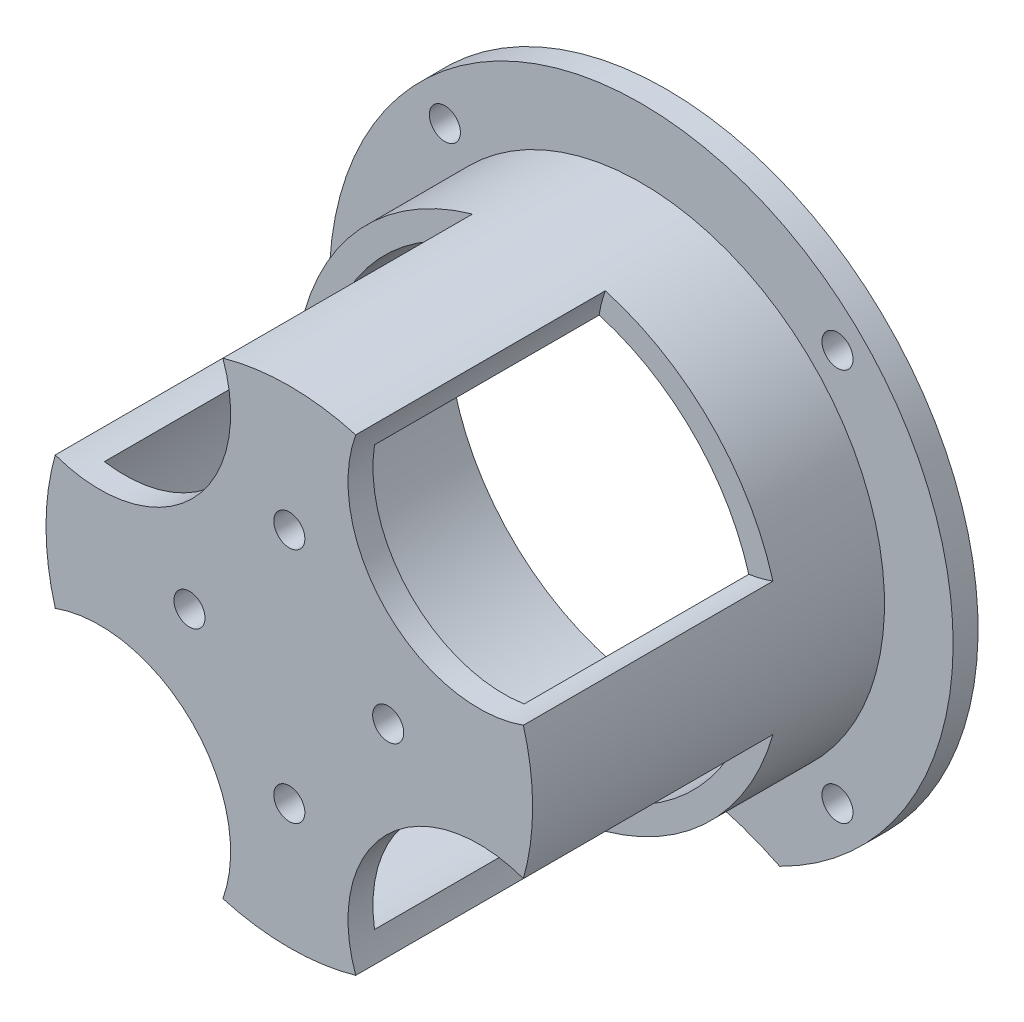
ISO-10303-21;
HEADER;
FILE_DESCRIPTION(('STEP AP214'),'2;1');
FILE_NAME('part.step','',(''),(''),'','','');
FILE_SCHEMA(('AUTOMOTIVE_DESIGN { 1 0 10303 214 1 1 1 1 }'));
ENDSEC;
DATA;
#1=APPLICATION_CONTEXT('core data for automotive mechanical design processes');
#2=APPLICATION_PROTOCOL_DEFINITION('international standard','automotive_design',2000,#1);
#3=PRODUCT_CONTEXT('',#1,'mechanical');
#4=PRODUCT('Part','Part','',(#3));
#5=PRODUCT_RELATED_PRODUCT_CATEGORY('part','',(#4));
#6=PRODUCT_DEFINITION_FORMATION('','',#4);
#7=PRODUCT_DEFINITION_CONTEXT('part definition',#1,'design');
#8=PRODUCT_DEFINITION('design','',#6,#7);
#9=PRODUCT_DEFINITION_SHAPE('','',#8);
#10=(LENGTH_UNIT() NAMED_UNIT(*) SI_UNIT(.MILLI.,.METRE.));
#11=(NAMED_UNIT(*) PLANE_ANGLE_UNIT() SI_UNIT($,.RADIAN.));
#12=(NAMED_UNIT(*) SI_UNIT($,.STERADIAN.) SOLID_ANGLE_UNIT());
#13=UNCERTAINTY_MEASURE_WITH_UNIT(LENGTH_MEASURE(1.E-05),#10,'distance_accuracy_value','');
#14=(GEOMETRIC_REPRESENTATION_CONTEXT(3) GLOBAL_UNCERTAINTY_ASSIGNED_CONTEXT((#13)) GLOBAL_UNIT_ASSIGNED_CONTEXT((#10,
#11,#12)) REPRESENTATION_CONTEXT('',''));
#15=CARTESIAN_POINT('',(0.,0.,0.));
#16=DIRECTION('',(0.,0.,1.));
#17=DIRECTION('',(1.,0.,0.));
#18=AXIS2_PLACEMENT_3D('',#15,#16,#17);
#19=CARTESIAN_POINT('',(0.,0.,0.));
#20=DIRECTION('',(0.,0.,1.));
#21=DIRECTION('',(1.,0.,0.));
#22=AXIS2_PLACEMENT_3D('',#19,#20,#21);
#23=CYLINDRICAL_SURFACE('',#22,9.75);
#24=DIRECTION('',(0.,0.,1.));
#25=VECTOR('',#24,1.);
#26=CARTESIAN_POINT('',(9.37964320773784,-2.66172750211913,-5.));
#27=LINE('',#26,#25);
#28=CARTESIAN_POINT('',(9.37964320773784,-2.66172750211913,-10.));
#29=VERTEX_POINT('',#28);
#30=CARTESIAN_POINT('',(9.37964320773784,-2.66172750211913,0.));
#31=VERTEX_POINT('',#30);
#32=EDGE_CURVE('E305',#29,#31,#27,.T.);
#33=ORIENTED_EDGE('',*,*,#32,.F.);
#34=CARTESIAN_POINT('',(0.,0.,-10.));
#35=DIRECTION('',(0.,0.,1.));
#36=DIRECTION('',(1.,0.,0.));
#37=AXIS2_PLACEMENT_3D('',#34,#35,#36);
#38=CIRCLE('',#37,9.75);
#39=CARTESIAN_POINT('',(2.66172750211911,-9.37964320773785,-10.));
#40=VERTEX_POINT('',#39);
#41=EDGE_CURVE('E299',#29,#40,#38,.F.);
#42=ORIENTED_EDGE('',*,*,#41,.T.);
#43=DIRECTION('',(0.,0.,1.));
#44=VECTOR('',#43,1.);
#45=CARTESIAN_POINT('',(2.6617275021191,-9.37964320773785,-5.));
#46=LINE('',#45,#44);
#47=CARTESIAN_POINT('',(2.66172750211911,-9.37964320773785,0.));
#48=VERTEX_POINT('',#47);
#49=EDGE_CURVE('E302',#48,#40,#46,.F.);
#50=ORIENTED_EDGE('',*,*,#49,.F.);
#51=CARTESIAN_POINT('',(0.,0.,0.));
#52=DIRECTION('',(0.,0.,1.));
#53=DIRECTION('',(1.,0.,0.));
#54=AXIS2_PLACEMENT_3D('',#51,#52,#53);
#55=CIRCLE('',#54,9.75);
#56=CARTESIAN_POINT('',(-2.66172750211913,-9.37964320773784,0.));
#57=VERTEX_POINT('',#56);
#58=EDGE_CURVE('E264',#57,#48,#55,.T.);
#59=ORIENTED_EDGE('',*,*,#58,.F.);
#60=DIRECTION('',(0.,0.,1.));
#61=VECTOR('',#60,1.);
#62=CARTESIAN_POINT('',(-2.66172750211913,-9.37964320773785,-5.));
#63=LINE('',#62,#61);
#64=CARTESIAN_POINT('',(-2.66172750211913,-9.37964320773784,-10.));
#65=VERTEX_POINT('',#64);
#66=EDGE_CURVE('E297',#65,#57,#63,.T.);
#67=ORIENTED_EDGE('',*,*,#66,.F.);
#68=CARTESIAN_POINT('',(0.,0.,-10.));
#69=DIRECTION('',(0.,0.,1.));
#70=DIRECTION('',(1.,0.,0.));
#71=AXIS2_PLACEMENT_3D('',#68,#69,#70);
#72=CIRCLE('',#71,9.75);
#73=CARTESIAN_POINT('',(-9.37964320773785,-2.6617275021191,-10.));
#74=VERTEX_POINT('',#73);
#75=EDGE_CURVE('E291',#65,#74,#72,.F.);
#76=ORIENTED_EDGE('',*,*,#75,.T.);
#77=DIRECTION('',(0.,0.,1.));
#78=VECTOR('',#77,1.);
#79=CARTESIAN_POINT('',(-9.37964320773786,-2.6617275021191,-5.));
#80=LINE('',#79,#78);
#81=CARTESIAN_POINT('',(-9.37964320773785,-2.6617275021191,0.));
#82=VERTEX_POINT('',#81);
#83=EDGE_CURVE('E294',#82,#74,#80,.F.);
#84=ORIENTED_EDGE('',*,*,#83,.F.);
#85=CARTESIAN_POINT('',(-9.37964320773784,2.66172750211913,0.));
#86=VERTEX_POINT('',#85);
#87=EDGE_CURVE('E431',#86,#82,#55,.T.);
#88=ORIENTED_EDGE('',*,*,#87,.F.);
#89=DIRECTION('',(0.,0.,1.));
#90=VECTOR('',#89,1.);
#91=CARTESIAN_POINT('',(-9.37964320773785,2.66172750211913,-5.));
#92=LINE('',#91,#90);
#93=CARTESIAN_POINT('',(-9.37964320773784,2.66172750211913,-10.));
#94=VERTEX_POINT('',#93);
#95=EDGE_CURVE('E289',#94,#86,#92,.T.);
#96=ORIENTED_EDGE('',*,*,#95,.F.);
#97=CARTESIAN_POINT('',(0.,0.,-10.));
#98=DIRECTION('',(0.,0.,1.));
#99=DIRECTION('',(1.,0.,0.));
#100=AXIS2_PLACEMENT_3D('',#97,#98,#99);
#101=CIRCLE('',#100,9.75);
#102=CARTESIAN_POINT('',(-2.6617275021191,9.37964320773785,-10.));
#103=VERTEX_POINT('',#102);
#104=EDGE_CURVE('E283',#94,#103,#101,.F.);
#105=ORIENTED_EDGE('',*,*,#104,.T.);
#106=DIRECTION('',(0.,0.,1.));
#107=VECTOR('',#106,1.);
#108=CARTESIAN_POINT('',(-2.6617275021191,9.37964320773786,-5.));
#109=LINE('',#108,#107);
#110=CARTESIAN_POINT('',(-2.6617275021191,9.37964320773785,0.));
#111=VERTEX_POINT('',#110);
#112=EDGE_CURVE('E286',#111,#103,#109,.F.);
#113=ORIENTED_EDGE('',*,*,#112,.F.);
#114=CARTESIAN_POINT('',(2.66172750211913,9.37964320773784,0.));
#115=VERTEX_POINT('',#114);
#116=EDGE_CURVE('E266',#115,#111,#55,.T.);
#117=ORIENTED_EDGE('',*,*,#116,.F.);
#118=DIRECTION('',(0.,0.,1.));
#119=VECTOR('',#118,1.);
#120=CARTESIAN_POINT('',(2.66172750211913,9.37964320773784,-5.));
#121=LINE('',#120,#119);
#122=CARTESIAN_POINT('',(2.66172750211913,9.37964320773784,-10.));
#123=VERTEX_POINT('',#122);
#124=EDGE_CURVE('E281',#123,#115,#121,.T.);
#125=ORIENTED_EDGE('',*,*,#124,.F.);
#126=CARTESIAN_POINT('',(0.,0.,-10.));
#127=DIRECTION('',(0.,0.,1.));
#128=DIRECTION('',(1.,0.,0.));
#129=AXIS2_PLACEMENT_3D('',#126,#127,#128);
#130=CIRCLE('',#129,9.75);
#131=CARTESIAN_POINT('',(9.37964320773785,2.6617275021191,-10.));
#132=VERTEX_POINT('',#131);
#133=EDGE_CURVE('E275',#123,#132,#130,.F.);
#134=ORIENTED_EDGE('',*,*,#133,.T.);
#135=DIRECTION('',(0.,0.,1.));
#136=VECTOR('',#135,1.);
#137=CARTESIAN_POINT('',(9.37964320773786,2.6617275021191,-5.));
#138=LINE('',#137,#136);
#139=CARTESIAN_POINT('',(9.37964320773785,2.6617275021191,0.));
#140=VERTEX_POINT('',#139);
#141=EDGE_CURVE('E278',#140,#132,#138,.F.);
#142=ORIENTED_EDGE('',*,*,#141,.F.);
#143=EDGE_CURVE('E261',#31,#140,#55,.T.);
#144=ORIENTED_EDGE('',*,*,#143,.F.);
#145=EDGE_LOOP('',(#33,#42,#50,#59,#67,#76,#84,#88,#96,#105,#113,#117,#125,#134,#142,#144));
#146=FACE_BOUND('',#145,.T.);
#147=CARTESIAN_POINT('',(0.,0.,-14.1));
#148=DIRECTION('',(0.,0.,-1.));
#149=DIRECTION('',(-1.,0.,0.));
#150=AXIS2_PLACEMENT_3D('',#147,#148,#149);
#151=CIRCLE('',#150,9.75);
#152=CARTESIAN_POINT('',(-9.75,0.,-14.1));
#153=VERTEX_POINT('',#152);
#154=EDGE_CURVE('E176',#153,#153,#151,.F.);
#155=ORIENTED_EDGE('',*,*,#154,.T.);
#156=EDGE_LOOP('',(#155));
#157=FACE_BOUND('',#156,.T.);
#158=ADVANCED_FACE('F35',(#146,#157),#23,.T.);
#159=CARTESIAN_POINT('',(0.,0.,0.));
#160=DIRECTION('',(0.,0.,1.));
#161=DIRECTION('',(1.,0.,0.));
#162=AXIS2_PLACEMENT_3D('',#159,#160,#161);
#163=PLANE('',#162);
#164=CARTESIAN_POINT('',(7.60139789775537,-7.6013978977554,0.));
#165=DIRECTION('',(0.,0.,1.));
#166=DIRECTION('',(1.,0.,0.));
#167=AXIS2_PLACEMENT_3D('',#164,#165,#166);
#168=CIRCLE('',#167,5.25);
#169=EDGE_CURVE('E191',#31,#48,#168,.T.);
#170=ORIENTED_EDGE('',*,*,#169,.F.);
#171=ORIENTED_EDGE('',*,*,#143,.T.);
#172=CARTESIAN_POINT('',(7.6013978977554,7.60139789775537,0.));
#173=DIRECTION('',(0.,0.,1.));
#174=DIRECTION('',(1.,0.,0.));
#175=AXIS2_PLACEMENT_3D('',#172,#173,#174);
#176=CIRCLE('',#175,5.25);
#177=EDGE_CURVE('E180',#115,#140,#176,.T.);
#178=ORIENTED_EDGE('',*,*,#177,.F.);
#179=ORIENTED_EDGE('',*,*,#116,.T.);
#180=CARTESIAN_POINT('',(-7.60139789775537,7.6013978977554,0.));
#181=DIRECTION('',(0.,0.,1.));
#182=DIRECTION('',(1.,0.,0.));
#183=AXIS2_PLACEMENT_3D('',#180,#181,#182);
#184=CIRCLE('',#183,5.25);
#185=EDGE_CURVE('E198',#86,#111,#184,.T.);
#186=ORIENTED_EDGE('',*,*,#185,.F.);
#187=ORIENTED_EDGE('',*,*,#87,.T.);
#188=CARTESIAN_POINT('',(-7.6013978977554,-7.60139789775537,0.));
#189=DIRECTION('',(0.,0.,1.));
#190=DIRECTION('',(1.,0.,0.));
#191=AXIS2_PLACEMENT_3D('',#188,#189,#190);
#192=CIRCLE('',#191,5.25);
#193=EDGE_CURVE('E193',#57,#82,#192,.T.);
#194=ORIENTED_EDGE('',*,*,#193,.F.);
#195=ORIENTED_EDGE('',*,*,#58,.T.);
#196=EDGE_LOOP('',(#170,#171,#178,#179,#186,#187,#194,#195));
#197=FACE_BOUND('',#196,.T.);
#198=CARTESIAN_POINT('',(0.,4.75,0.));
#199=DIRECTION('',(0.,0.,1.));
#200=DIRECTION('',(1.,0.,0.));
#201=AXIS2_PLACEMENT_3D('',#198,#199,#200);
#202=CIRCLE('',#201,0.6225);
#203=CARTESIAN_POINT('',(0.6225,4.75,0.));
#204=VERTEX_POINT('',#203);
#205=EDGE_CURVE('E204',#204,#204,#202,.T.);
#206=ORIENTED_EDGE('',*,*,#205,.F.);
#207=EDGE_LOOP('',(#206));
#208=FACE_BOUND('',#207,.T.);
#209=CARTESIAN_POINT('',(3.96157843976001,0.,0.));
#210=DIRECTION('',(0.,0.,1.));
#211=DIRECTION('',(1.,0.,0.));
#212=AXIS2_PLACEMENT_3D('',#209,#210,#211);
#213=CIRCLE('',#212,0.6225);
#214=CARTESIAN_POINT('',(4.58407843976001,0.,0.));
#215=VERTEX_POINT('',#214);
#216=EDGE_CURVE('E207',#215,#215,#213,.T.);
#217=ORIENTED_EDGE('',*,*,#216,.F.);
#218=EDGE_LOOP('',(#217));
#219=FACE_BOUND('',#218,.T.);
#220=CARTESIAN_POINT('',(0.,-4.75,0.));
#221=DIRECTION('',(0.,0.,1.));
#222=DIRECTION('',(1.,0.,0.));
#223=AXIS2_PLACEMENT_3D('',#220,#221,#222);
#224=CIRCLE('',#223,0.6225);
#225=CARTESIAN_POINT('',(0.6225,-4.75,0.));
#226=VERTEX_POINT('',#225);
#227=EDGE_CURVE('E212',#226,#226,#224,.T.);
#228=ORIENTED_EDGE('',*,*,#227,.F.);
#229=EDGE_LOOP('',(#228));
#230=FACE_BOUND('',#229,.T.);
#231=CARTESIAN_POINT('',(-4.,0.,0.));
#232=DIRECTION('',(0.,0.,1.));
#233=DIRECTION('',(1.,0.,0.));
#234=AXIS2_PLACEMENT_3D('',#231,#232,#233);
#235=CIRCLE('',#234,0.6225);
#236=CARTESIAN_POINT('',(-3.3775,0.,0.));
#237=VERTEX_POINT('',#236);
#238=EDGE_CURVE('E215',#237,#237,#235,.T.);
#239=ORIENTED_EDGE('',*,*,#238,.F.);
#240=EDGE_LOOP('',(#239));
#241=FACE_BOUND('',#240,.T.);
#242=ADVANCED_FACE('F385',(#197,#208,#219,#230,#241),#163,.T.);
#243=CARTESIAN_POINT('',(8.75,0.,-1.));
#244=DIRECTION('',(0.,0.,-1.));
#245=DIRECTION('',(-1.,0.,0.));
#246=AXIS2_PLACEMENT_3D('',#243,#244,#245);
#247=PLANE('',#246);
#248=CARTESIAN_POINT('',(7.60139789775537,-7.6013978977554,-1.));
#249=DIRECTION('',(0.,0.,-1.));
#250=DIRECTION('',(-1.,0.,0.));
#251=AXIS2_PLACEMENT_3D('',#248,#249,#250);
#252=CIRCLE('',#251,5.25);
#253=CARTESIAN_POINT('',(2.41410221173649,-8.41038706072967,-1.));
#254=VERTEX_POINT('',#253);
#255=CARTESIAN_POINT('',(8.41038706072966,-2.41410221173651,-1.));
#256=VERTEX_POINT('',#255);
#257=EDGE_CURVE('E255',#254,#256,#252,.T.);
#258=ORIENTED_EDGE('',*,*,#257,.F.);
#259=CARTESIAN_POINT('',(0.,0.,-1.));
#260=DIRECTION('',(0.,0.,1.));
#261=DIRECTION('',(1.,0.,0.));
#262=AXIS2_PLACEMENT_3D('',#259,#260,#261);
#263=CIRCLE('',#262,8.75);
#264=CARTESIAN_POINT('',(-2.41410221173651,-8.41038706072966,-1.));
#265=VERTEX_POINT('',#264);
#266=EDGE_CURVE('E273',#265,#254,#263,.T.);
#267=ORIENTED_EDGE('',*,*,#266,.F.);
#268=CARTESIAN_POINT('',(-7.6013978977554,-7.60139789775537,-1.));
#269=DIRECTION('',(0.,0.,-1.));
#270=DIRECTION('',(-1.,0.,0.));
#271=AXIS2_PLACEMENT_3D('',#268,#269,#270);
#272=CIRCLE('',#271,5.25);
#273=CARTESIAN_POINT('',(-8.41038706072967,-2.41410221173648,-1.));
#274=VERTEX_POINT('',#273);
#275=EDGE_CURVE('E245',#274,#265,#272,.T.);
#276=ORIENTED_EDGE('',*,*,#275,.F.);
#277=CARTESIAN_POINT('',(-8.41038706072966,2.41410221173651,-1.));
#278=VERTEX_POINT('',#277);
#279=EDGE_CURVE('E449',#278,#274,#263,.T.);
#280=ORIENTED_EDGE('',*,*,#279,.F.);
#281=CARTESIAN_POINT('',(-7.60139789775537,7.6013978977554,-1.));
#282=DIRECTION('',(0.,0.,-1.));
#283=DIRECTION('',(-1.,0.,0.));
#284=AXIS2_PLACEMENT_3D('',#281,#282,#283);
#285=CIRCLE('',#284,5.25);
#286=CARTESIAN_POINT('',(-2.41410221173648,8.41038706072967,-1.));
#287=VERTEX_POINT('',#286);
#288=EDGE_CURVE('E235',#287,#278,#285,.T.);
#289=ORIENTED_EDGE('',*,*,#288,.F.);
#290=CARTESIAN_POINT('',(2.41410221173651,8.41038706072966,-1.));
#291=VERTEX_POINT('',#290);
#292=EDGE_CURVE('E274',#291,#287,#263,.T.);
#293=ORIENTED_EDGE('',*,*,#292,.F.);
#294=CARTESIAN_POINT('',(7.6013978977554,7.60139789775537,-1.));
#295=DIRECTION('',(0.,0.,-1.));
#296=DIRECTION('',(-1.,0.,0.));
#297=AXIS2_PLACEMENT_3D('',#294,#295,#296);
#298=CIRCLE('',#297,5.25);
#299=CARTESIAN_POINT('',(8.41038706072967,2.41410221173648,-1.));
#300=VERTEX_POINT('',#299);
#301=EDGE_CURVE('E225',#300,#291,#298,.T.);
#302=ORIENTED_EDGE('',*,*,#301,.F.);
#303=EDGE_CURVE('E270',#256,#300,#263,.T.);
#304=ORIENTED_EDGE('',*,*,#303,.F.);
#305=EDGE_LOOP('',(#258,#267,#276,#280,#289,#293,#302,#304));
#306=FACE_BOUND('',#305,.T.);
#307=CARTESIAN_POINT('',(0.,4.75,-1.));
#308=DIRECTION('',(0.,0.,-1.));
#309=DIRECTION('',(-1.,0.,0.));
#310=AXIS2_PLACEMENT_3D('',#307,#308,#309);
#311=CIRCLE('',#310,0.6225);
#312=CARTESIAN_POINT('',(-0.6225,4.75,-1.));
#313=VERTEX_POINT('',#312);
#314=EDGE_CURVE('E265',#313,#313,#311,.T.);
#315=ORIENTED_EDGE('',*,*,#314,.F.);
#316=EDGE_LOOP('',(#315));
#317=FACE_BOUND('',#316,.T.);
#318=CARTESIAN_POINT('',(3.96157843976001,0.,-1.));
#319=DIRECTION('',(0.,0.,-1.));
#320=DIRECTION('',(-1.,0.,0.));
#321=AXIS2_PLACEMENT_3D('',#318,#319,#320);
#322=CIRCLE('',#321,0.6225);
#323=CARTESIAN_POINT('',(3.33907843976001,0.,-1.));
#324=VERTEX_POINT('',#323);
#325=EDGE_CURVE('E313',#324,#324,#322,.T.);
#326=ORIENTED_EDGE('',*,*,#325,.F.);
#327=EDGE_LOOP('',(#326));
#328=FACE_BOUND('',#327,.T.);
#329=CARTESIAN_POINT('',(0.,-4.75,-1.));
#330=DIRECTION('',(0.,0.,-1.));
#331=DIRECTION('',(-1.,0.,0.));
#332=AXIS2_PLACEMENT_3D('',#329,#330,#331);
#333=CIRCLE('',#332,0.6225);
#334=CARTESIAN_POINT('',(-0.6225,-4.75,-1.));
#335=VERTEX_POINT('',#334);
#336=EDGE_CURVE('E310',#335,#335,#333,.T.);
#337=ORIENTED_EDGE('',*,*,#336,.F.);
#338=EDGE_LOOP('',(#337));
#339=FACE_BOUND('',#338,.T.);
#340=CARTESIAN_POINT('',(-4.,0.,-1.));
#341=DIRECTION('',(0.,0.,-1.));
#342=DIRECTION('',(-1.,0.,0.));
#343=AXIS2_PLACEMENT_3D('',#340,#341,#342);
#344=CIRCLE('',#343,0.6225);
#345=CARTESIAN_POINT('',(-4.6225,0.,-1.));
#346=VERTEX_POINT('',#345);
#347=EDGE_CURVE('E260',#346,#346,#344,.T.);
#348=ORIENTED_EDGE('',*,*,#347,.F.);
#349=EDGE_LOOP('',(#348));
#350=FACE_BOUND('',#349,.T.);
#351=ADVANCED_FACE('F393',(#306,#317,#328,#339,#350),#247,.T.);
#352=CARTESIAN_POINT('',(0.,0.,0.));
#353=DIRECTION('',(0.,0.,1.));
#354=DIRECTION('',(1.,0.,0.));
#355=AXIS2_PLACEMENT_3D('',#352,#353,#354);
#356=CYLINDRICAL_SURFACE('',#355,8.75);
#357=CARTESIAN_POINT('',(0.,0.,-15.1));
#358=DIRECTION('',(0.,0.,1.));
#359=DIRECTION('',(1.,0.,0.));
#360=AXIS2_PLACEMENT_3D('',#357,#358,#359);
#361=CIRCLE('',#360,8.75);
#362=CARTESIAN_POINT('',(8.75,0.,-15.1));
#363=VERTEX_POINT('',#362);
#364=EDGE_CURVE('E267',#363,#363,#361,.T.);
#365=ORIENTED_EDGE('',*,*,#364,.F.);
#366=EDGE_LOOP('',(#365));
#367=FACE_BOUND('',#366,.T.);
#368=DIRECTION('',(0.,0.,1.));
#369=VECTOR('',#368,1.);
#370=CARTESIAN_POINT('',(8.41038706072966,-2.41410221173651,-5.));
#371=LINE('',#370,#369);
#372=CARTESIAN_POINT('',(8.41038706072966,-2.41410221173651,-10.));
#373=VERTEX_POINT('',#372);
#374=EDGE_CURVE('E257',#256,#373,#371,.F.);
#375=ORIENTED_EDGE('',*,*,#374,.F.);
#376=ORIENTED_EDGE('',*,*,#303,.T.);
#377=DIRECTION('',(0.,0.,1.));
#378=VECTOR('',#377,1.);
#379=CARTESIAN_POINT('',(8.41038706072967,2.41410221173648,-5.));
#380=LINE('',#379,#378);
#381=CARTESIAN_POINT('',(8.41038706072967,2.41410221173648,-10.));
#382=VERTEX_POINT('',#381);
#383=EDGE_CURVE('E223',#382,#300,#380,.T.);
#384=ORIENTED_EDGE('',*,*,#383,.F.);
#385=CARTESIAN_POINT('',(0.,0.,-10.));
#386=DIRECTION('',(0.,0.,1.));
#387=DIRECTION('',(1.,0.,0.));
#388=AXIS2_PLACEMENT_3D('',#385,#386,#387);
#389=CIRCLE('',#388,8.75);
#390=CARTESIAN_POINT('',(2.41410221173651,8.41038706072966,-10.));
#391=VERTEX_POINT('',#390);
#392=EDGE_CURVE('E220',#382,#391,#389,.T.);
#393=ORIENTED_EDGE('',*,*,#392,.T.);
#394=DIRECTION('',(0.,0.,1.));
#395=VECTOR('',#394,1.);
#396=CARTESIAN_POINT('',(2.41410221173651,8.41038706072966,-5.));
#397=LINE('',#396,#395);
#398=EDGE_CURVE('E227',#291,#391,#397,.F.);
#399=ORIENTED_EDGE('',*,*,#398,.F.);
#400=ORIENTED_EDGE('',*,*,#292,.T.);
#401=DIRECTION('',(0.,0.,1.));
#402=VECTOR('',#401,1.);
#403=CARTESIAN_POINT('',(-2.41410221173648,8.41038706072967,-5.));
#404=LINE('',#403,#402);
#405=CARTESIAN_POINT('',(-2.41410221173648,8.41038706072967,-10.));
#406=VERTEX_POINT('',#405);
#407=EDGE_CURVE('E233',#406,#287,#404,.T.);
#408=ORIENTED_EDGE('',*,*,#407,.F.);
#409=CARTESIAN_POINT('',(0.,0.,-10.));
#410=DIRECTION('',(0.,0.,1.));
#411=DIRECTION('',(1.,0.,0.));
#412=AXIS2_PLACEMENT_3D('',#409,#410,#411);
#413=CIRCLE('',#412,8.75);
#414=CARTESIAN_POINT('',(-8.41038706072966,2.41410221173651,-10.));
#415=VERTEX_POINT('',#414);
#416=EDGE_CURVE('E230',#406,#415,#413,.T.);
#417=ORIENTED_EDGE('',*,*,#416,.T.);
#418=DIRECTION('',(0.,0.,1.));
#419=VECTOR('',#418,1.);
#420=CARTESIAN_POINT('',(-8.41038706072966,2.41410221173651,-5.));
#421=LINE('',#420,#419);
#422=EDGE_CURVE('E237',#278,#415,#421,.F.);
#423=ORIENTED_EDGE('',*,*,#422,.F.);
#424=ORIENTED_EDGE('',*,*,#279,.T.);
#425=DIRECTION('',(0.,0.,1.));
#426=VECTOR('',#425,1.);
#427=CARTESIAN_POINT('',(-8.41038706072967,-2.41410221173648,-5.));
#428=LINE('',#427,#426);
#429=CARTESIAN_POINT('',(-8.41038706072967,-2.41410221173648,-10.));
#430=VERTEX_POINT('',#429);
#431=EDGE_CURVE('E243',#430,#274,#428,.T.);
#432=ORIENTED_EDGE('',*,*,#431,.F.);
#433=CARTESIAN_POINT('',(0.,0.,-10.));
#434=DIRECTION('',(0.,0.,1.));
#435=DIRECTION('',(1.,0.,0.));
#436=AXIS2_PLACEMENT_3D('',#433,#434,#435);
#437=CIRCLE('',#436,8.75);
#438=CARTESIAN_POINT('',(-2.41410221173651,-8.41038706072966,-10.));
#439=VERTEX_POINT('',#438);
#440=EDGE_CURVE('E240',#430,#439,#437,.T.);
#441=ORIENTED_EDGE('',*,*,#440,.T.);
#442=DIRECTION('',(0.,0.,1.));
#443=VECTOR('',#442,1.);
#444=CARTESIAN_POINT('',(-2.41410221173651,-8.41038706072966,-5.));
#445=LINE('',#444,#443);
#446=EDGE_CURVE('E247',#265,#439,#445,.F.);
#447=ORIENTED_EDGE('',*,*,#446,.F.);
#448=ORIENTED_EDGE('',*,*,#266,.T.);
#449=DIRECTION('',(0.,0.,1.));
#450=VECTOR('',#449,1.);
#451=CARTESIAN_POINT('',(2.41410221173649,-8.41038706072967,-5.));
#452=LINE('',#451,#450);
#453=CARTESIAN_POINT('',(2.41410221173649,-8.41038706072967,-10.));
#454=VERTEX_POINT('',#453);
#455=EDGE_CURVE('E253',#454,#254,#452,.T.);
#456=ORIENTED_EDGE('',*,*,#455,.F.);
#457=CARTESIAN_POINT('',(0.,0.,-10.));
#458=DIRECTION('',(0.,0.,1.));
#459=DIRECTION('',(1.,0.,0.));
#460=AXIS2_PLACEMENT_3D('',#457,#458,#459);
#461=CIRCLE('',#460,8.75);
#462=EDGE_CURVE('E250',#454,#373,#461,.T.);
#463=ORIENTED_EDGE('',*,*,#462,.T.);
#464=EDGE_LOOP('',(#375,#376,#384,#393,#399,#400,#408,#417,#423,#424,#432,#441,#447,#448,#456,#463));
#465=FACE_BOUND('',#464,.T.);
#466=ADVANCED_FACE('F389',(#367,#465),#356,.F.);
#467=CARTESIAN_POINT('',(8.75,0.,-15.1));
#468=DIRECTION('',(0.,0.,-1.));
#469=DIRECTION('',(-1.,0.,0.));
#470=AXIS2_PLACEMENT_3D('',#467,#468,#469);
#471=PLANE('',#470);
#472=CARTESIAN_POINT('',(0.,0.,-15.1));
#473=DIRECTION('',(0.,0.,-1.));
#474=DIRECTION('',(-1.,0.,0.));
#475=AXIS2_PLACEMENT_3D('',#472,#473,#474);
#476=CIRCLE('',#475,12.5);
#477=CARTESIAN_POINT('',(-6.09130559538966,-10.9154017857143,-15.1));
#478=VERTEX_POINT('',#477);
#479=CARTESIAN_POINT('',(6.09130559538966,-10.9154017857143,-15.1));
#480=VERTEX_POINT('',#479);
#481=EDGE_CURVE('E177',#478,#480,#476,.T.);
#482=ORIENTED_EDGE('',*,*,#481,.T.);
#483=CARTESIAN_POINT('',(0.,-22.4,-15.1));
#484=DIRECTION('',(0.,0.,-1.));
#485=DIRECTION('',(-1.,0.,0.));
#486=AXIS2_PLACEMENT_3D('',#483,#484,#485);
#487=CIRCLE('',#486,13.);
#488=EDGE_CURVE('E307',#480,#478,#487,.F.);
#489=ORIENTED_EDGE('',*,*,#488,.T.);
#490=EDGE_LOOP('',(#482,#489));
#491=FACE_BOUND('',#490,.T.);
#492=CARTESIAN_POINT('',(-7.86656294070034,7.8665629406999,-15.1));
#493=DIRECTION('',(0.,0.,1.));
#494=DIRECTION('',(1.,0.,0.));
#495=AXIS2_PLACEMENT_3D('',#492,#493,#494);
#496=CIRCLE('',#495,0.622500000000543);
#497=CARTESIAN_POINT('',(-7.2440629406998,7.8665629406999,-15.1));
#498=VERTEX_POINT('',#497);
#499=EDGE_CURVE('E509',#498,#498,#496,.T.);
#500=ORIENTED_EDGE('',*,*,#499,.T.);
#501=EDGE_LOOP('',(#500));
#502=FACE_BOUND('',#501,.T.);
#503=CARTESIAN_POINT('',(-7.8665629406999,-7.86656294070078,-15.1));
#504=DIRECTION('',(0.,0.,1.));
#505=DIRECTION('',(1.,0.,0.));
#506=AXIS2_PLACEMENT_3D('',#503,#504,#505);
#507=CIRCLE('',#506,0.622500000000394);
#508=CARTESIAN_POINT('',(-7.2440629406995,-7.86656294070078,-15.1));
#509=VERTEX_POINT('',#508);
#510=EDGE_CURVE('E502',#509,#509,#507,.T.);
#511=ORIENTED_EDGE('',*,*,#510,.T.);
#512=EDGE_LOOP('',(#511));
#513=FACE_BOUND('',#512,.T.);
#514=CARTESIAN_POINT('',(7.86656294070078,-7.86656294070034,-15.1));
#515=DIRECTION('',(0.,0.,1.));
#516=DIRECTION('',(1.,0.,0.));
#517=AXIS2_PLACEMENT_3D('',#514,#515,#516);
#518=CIRCLE('',#517,0.622499999999954);
#519=CARTESIAN_POINT('',(8.48906294070073,-7.86656294070034,-15.1));
#520=VERTEX_POINT('',#519);
#521=EDGE_CURVE('E496',#520,#520,#518,.T.);
#522=ORIENTED_EDGE('',*,*,#521,.T.);
#523=EDGE_LOOP('',(#522));
#524=FACE_BOUND('',#523,.T.);
#525=CARTESIAN_POINT('',(7.86656294070044,7.86656294070025,-15.1));
#526=DIRECTION('',(0.,0.,1.));
#527=DIRECTION('',(1.,0.,0.));
#528=AXIS2_PLACEMENT_3D('',#525,#526,#527);
#529=CIRCLE('',#528,0.6225);
#530=CARTESIAN_POINT('',(8.48906294070044,7.86656294070025,-15.1));
#531=VERTEX_POINT('',#530);
#532=EDGE_CURVE('E183',#531,#531,#529,.T.);
#533=ORIENTED_EDGE('',*,*,#532,.T.);
#534=EDGE_LOOP('',(#533));
#535=FACE_BOUND('',#534,.T.);
#536=ORIENTED_EDGE('',*,*,#364,.T.);
#537=EDGE_LOOP('',(#536));
#538=FACE_BOUND('',#537,.T.);
#539=ADVANCED_FACE('F359',(#491,#502,#513,#524,#535,#538),#471,.T.);
#540=CARTESIAN_POINT('',(7.6013978977554,7.60139789775537,-10.));
#541=DIRECTION('',(0.,0.,1.));
#542=DIRECTION('',(1.,0.,0.));
#543=AXIS2_PLACEMENT_3D('',#540,#541,#542);
#544=CYLINDRICAL_SURFACE('',#543,5.25);
#545=ORIENTED_EDGE('',*,*,#398,.T.);
#546=CARTESIAN_POINT('',(7.6013978977554,7.60139789775537,-10.));
#547=DIRECTION('',(0.,0.,1.));
#548=DIRECTION('',(1.,0.,0.));
#549=AXIS2_PLACEMENT_3D('',#546,#547,#548);
#550=CIRCLE('',#549,5.25);
#551=EDGE_CURVE('E200',#123,#391,#550,.T.);
#552=ORIENTED_EDGE('',*,*,#551,.F.);
#553=ORIENTED_EDGE('',*,*,#124,.T.);
#554=ORIENTED_EDGE('',*,*,#177,.T.);
#555=ORIENTED_EDGE('',*,*,#141,.T.);
#556=EDGE_CURVE('E202',#382,#132,#550,.T.);
#557=ORIENTED_EDGE('',*,*,#556,.F.);
#558=ORIENTED_EDGE('',*,*,#383,.T.);
#559=ORIENTED_EDGE('',*,*,#301,.T.);
#560=EDGE_LOOP('',(#545,#552,#553,#554,#555,#557,#558,#559));
#561=FACE_BOUND('',#560,.T.);
#562=ADVANCED_FACE('F355',(#561),#544,.F.);
#563=CARTESIAN_POINT('',(7.6013978977554,7.60139789775537,-10.));
#564=DIRECTION('',(0.,0.,1.));
#565=DIRECTION('',(1.,0.,0.));
#566=AXIS2_PLACEMENT_3D('',#563,#564,#565);
#567=PLANE('',#566);
#568=ORIENTED_EDGE('',*,*,#556,.T.);
#569=ORIENTED_EDGE('',*,*,#133,.F.);
#570=ORIENTED_EDGE('',*,*,#551,.T.);
#571=ORIENTED_EDGE('',*,*,#392,.F.);
#572=EDGE_LOOP('',(#568,#569,#570,#571));
#573=FACE_BOUND('',#572,.T.);
#574=ADVANCED_FACE('F351',(#573),#567,.T.);
#575=CARTESIAN_POINT('',(-7.60139789775537,7.6013978977554,-10.));
#576=DIRECTION('',(0.,0.,1.));
#577=DIRECTION('',(1.,0.,0.));
#578=AXIS2_PLACEMENT_3D('',#575,#576,#577);
#579=CYLINDRICAL_SURFACE('',#578,5.25);
#580=ORIENTED_EDGE('',*,*,#422,.T.);
#581=CARTESIAN_POINT('',(-7.60139789775537,7.6013978977554,-10.));
#582=DIRECTION('',(0.,0.,1.));
#583=DIRECTION('',(1.,0.,0.));
#584=AXIS2_PLACEMENT_3D('',#581,#582,#583);
#585=CIRCLE('',#584,5.25);
#586=EDGE_CURVE('E197',#94,#415,#585,.T.);
#587=ORIENTED_EDGE('',*,*,#586,.F.);
#588=ORIENTED_EDGE('',*,*,#95,.T.);
#589=ORIENTED_EDGE('',*,*,#185,.T.);
#590=ORIENTED_EDGE('',*,*,#112,.T.);
#591=EDGE_CURVE('E195',#406,#103,#585,.T.);
#592=ORIENTED_EDGE('',*,*,#591,.F.);
#593=ORIENTED_EDGE('',*,*,#407,.T.);
#594=ORIENTED_EDGE('',*,*,#288,.T.);
#595=EDGE_LOOP('',(#580,#587,#588,#589,#590,#592,#593,#594));
#596=FACE_BOUND('',#595,.T.);
#597=ADVANCED_FACE('F347',(#596),#579,.F.);
#598=CARTESIAN_POINT('',(-7.60139789775537,7.6013978977554,-10.));
#599=DIRECTION('',(0.,0.,1.));
#600=DIRECTION('',(1.,0.,0.));
#601=AXIS2_PLACEMENT_3D('',#598,#599,#600);
#602=PLANE('',#601);
#603=ORIENTED_EDGE('',*,*,#591,.T.);
#604=ORIENTED_EDGE('',*,*,#104,.F.);
#605=ORIENTED_EDGE('',*,*,#586,.T.);
#606=ORIENTED_EDGE('',*,*,#416,.F.);
#607=EDGE_LOOP('',(#603,#604,#605,#606));
#608=FACE_BOUND('',#607,.T.);
#609=ADVANCED_FACE('F343',(#608),#602,.T.);
#610=CARTESIAN_POINT('',(-7.6013978977554,-7.60139789775537,-10.));
#611=DIRECTION('',(0.,0.,1.));
#612=DIRECTION('',(1.,0.,0.));
#613=AXIS2_PLACEMENT_3D('',#610,#611,#612);
#614=CYLINDRICAL_SURFACE('',#613,5.25);
#615=ORIENTED_EDGE('',*,*,#446,.T.);
#616=CARTESIAN_POINT('',(-7.6013978977554,-7.60139789775537,-10.));
#617=DIRECTION('',(0.,0.,1.));
#618=DIRECTION('',(1.,0.,0.));
#619=AXIS2_PLACEMENT_3D('',#616,#617,#618);
#620=CIRCLE('',#619,5.25);
#621=EDGE_CURVE('E192',#65,#439,#620,.T.);
#622=ORIENTED_EDGE('',*,*,#621,.F.);
#623=ORIENTED_EDGE('',*,*,#66,.T.);
#624=ORIENTED_EDGE('',*,*,#193,.T.);
#625=ORIENTED_EDGE('',*,*,#83,.T.);
#626=EDGE_CURVE('E189',#430,#74,#620,.T.);
#627=ORIENTED_EDGE('',*,*,#626,.F.);
#628=ORIENTED_EDGE('',*,*,#431,.T.);
#629=ORIENTED_EDGE('',*,*,#275,.T.);
#630=EDGE_LOOP('',(#615,#622,#623,#624,#625,#627,#628,#629));
#631=FACE_BOUND('',#630,.T.);
#632=ADVANCED_FACE('F339',(#631),#614,.F.);
#633=CARTESIAN_POINT('',(-7.6013978977554,-7.60139789775537,-10.));
#634=DIRECTION('',(0.,0.,1.));
#635=DIRECTION('',(1.,0.,0.));
#636=AXIS2_PLACEMENT_3D('',#633,#634,#635);
#637=PLANE('',#636);
#638=ORIENTED_EDGE('',*,*,#626,.T.);
#639=ORIENTED_EDGE('',*,*,#75,.F.);
#640=ORIENTED_EDGE('',*,*,#621,.T.);
#641=ORIENTED_EDGE('',*,*,#440,.F.);
#642=EDGE_LOOP('',(#638,#639,#640,#641));
#643=FACE_BOUND('',#642,.T.);
#644=ADVANCED_FACE('F334',(#643),#637,.T.);
#645=CARTESIAN_POINT('',(7.60139789775537,-7.6013978977554,-10.));
#646=DIRECTION('',(0.,0.,1.));
#647=DIRECTION('',(1.,0.,0.));
#648=AXIS2_PLACEMENT_3D('',#645,#646,#647);
#649=CYLINDRICAL_SURFACE('',#648,5.25);
#650=ORIENTED_EDGE('',*,*,#374,.T.);
#651=CARTESIAN_POINT('',(7.60139789775537,-7.6013978977554,-10.));
#652=DIRECTION('',(0.,0.,1.));
#653=DIRECTION('',(1.,0.,0.));
#654=AXIS2_PLACEMENT_3D('',#651,#652,#653);
#655=CIRCLE('',#654,5.25);
#656=EDGE_CURVE('E208',#29,#373,#655,.T.);
#657=ORIENTED_EDGE('',*,*,#656,.F.);
#658=ORIENTED_EDGE('',*,*,#32,.T.);
#659=ORIENTED_EDGE('',*,*,#169,.T.);
#660=ORIENTED_EDGE('',*,*,#49,.T.);
#661=EDGE_CURVE('E210',#454,#40,#655,.T.);
#662=ORIENTED_EDGE('',*,*,#661,.F.);
#663=ORIENTED_EDGE('',*,*,#455,.T.);
#664=ORIENTED_EDGE('',*,*,#257,.T.);
#665=EDGE_LOOP('',(#650,#657,#658,#659,#660,#662,#663,#664));
#666=FACE_BOUND('',#665,.T.);
#667=ADVANCED_FACE('F338',(#666),#649,.F.);
#668=CARTESIAN_POINT('',(7.60139789775537,-7.6013978977554,-10.));
#669=DIRECTION('',(0.,0.,1.));
#670=DIRECTION('',(1.,0.,0.));
#671=AXIS2_PLACEMENT_3D('',#668,#669,#670);
#672=PLANE('',#671);
#673=ORIENTED_EDGE('',*,*,#661,.T.);
#674=ORIENTED_EDGE('',*,*,#41,.F.);
#675=ORIENTED_EDGE('',*,*,#656,.T.);
#676=ORIENTED_EDGE('',*,*,#462,.F.);
#677=EDGE_LOOP('',(#673,#674,#675,#676));
#678=FACE_BOUND('',#677,.T.);
#679=ADVANCED_FACE('F365',(#678),#672,.T.);
#680=CARTESIAN_POINT('',(-4.,0.,-10.));
#681=DIRECTION('',(0.,0.,1.));
#682=DIRECTION('',(1.,0.,0.));
#683=AXIS2_PLACEMENT_3D('',#680,#681,#682);
#684=CYLINDRICAL_SURFACE('',#683,0.6225);
#685=ORIENTED_EDGE('',*,*,#347,.T.);
#686=EDGE_LOOP('',(#685));
#687=FACE_BOUND('',#686,.T.);
#688=ORIENTED_EDGE('',*,*,#238,.T.);
#689=EDGE_LOOP('',(#688));
#690=FACE_BOUND('',#689,.T.);
#691=ADVANCED_FACE('F368',(#687,#690),#684,.F.);
#692=CARTESIAN_POINT('',(0.,-4.75,-10.));
#693=DIRECTION('',(0.,0.,1.));
#694=DIRECTION('',(1.,0.,0.));
#695=AXIS2_PLACEMENT_3D('',#692,#693,#694);
#696=CYLINDRICAL_SURFACE('',#695,0.6225);
#697=ORIENTED_EDGE('',*,*,#336,.T.);
#698=EDGE_LOOP('',(#697));
#699=FACE_BOUND('',#698,.T.);
#700=ORIENTED_EDGE('',*,*,#227,.T.);
#701=EDGE_LOOP('',(#700));
#702=FACE_BOUND('',#701,.T.);
#703=ADVANCED_FACE('F373',(#699,#702),#696,.F.);
#704=CARTESIAN_POINT('',(3.96157843976001,0.,-10.));
#705=DIRECTION('',(0.,0.,1.));
#706=DIRECTION('',(1.,0.,0.));
#707=AXIS2_PLACEMENT_3D('',#704,#705,#706);
#708=CYLINDRICAL_SURFACE('',#707,0.6225);
#709=ORIENTED_EDGE('',*,*,#325,.T.);
#710=EDGE_LOOP('',(#709));
#711=FACE_BOUND('',#710,.T.);
#712=ORIENTED_EDGE('',*,*,#216,.T.);
#713=EDGE_LOOP('',(#712));
#714=FACE_BOUND('',#713,.T.);
#715=ADVANCED_FACE('F363',(#711,#714),#708,.F.);
#716=CARTESIAN_POINT('',(0.,4.75,-10.));
#717=DIRECTION('',(0.,0.,1.));
#718=DIRECTION('',(1.,0.,0.));
#719=AXIS2_PLACEMENT_3D('',#716,#717,#718);
#720=CYLINDRICAL_SURFACE('',#719,0.6225);
#721=ORIENTED_EDGE('',*,*,#314,.T.);
#722=EDGE_LOOP('',(#721));
#723=FACE_BOUND('',#722,.T.);
#724=ORIENTED_EDGE('',*,*,#205,.T.);
#725=EDGE_LOOP('',(#724));
#726=FACE_BOUND('',#725,.T.);
#727=ADVANCED_FACE('F332',(#723,#726),#720,.F.);
#728=CARTESIAN_POINT('',(0.,0.,-14.1));
#729=DIRECTION('',(0.,0.,-1.));
#730=DIRECTION('',(-1.,0.,0.));
#731=AXIS2_PLACEMENT_3D('',#728,#729,#730);
#732=CYLINDRICAL_SURFACE('',#731,12.5);
#733=ORIENTED_EDGE('',*,*,#481,.F.);
#734=CARTESIAN_POINT('',(-6.09130559538966,-10.9154017857143,-15.1));
#735=CARTESIAN_POINT('',(-6.04730182992769,-10.9399578386372,-15.0576881460098));
#736=CARTESIAN_POINT('',(-6.00304141552776,-10.9643083772694,-15.0155236070646));
#737=CARTESIAN_POINT('',(-5.9140038703804,-11.0125893031327,-14.93151443298));
#738=CARTESIAN_POINT('',(-5.86922680894788,-11.0365197456635,-14.8896697561509));
#739=CARTESIAN_POINT('',(-5.77914077873879,-11.0839579287027,-14.8063142487232));
#740=CARTESIAN_POINT('',(-5.73383180873062,-11.1074656682321,-14.7648034188979));
#741=CARTESIAN_POINT('',(-5.64266586228431,-11.1540549613813,-14.6821320701101));
#742=CARTESIAN_POINT('',(-5.59680881394605,-11.1771364580504,-14.6409715983496));
#743=CARTESIAN_POINT('',(-5.55067563455117,-11.2,-14.6));
#744=B_SPLINE_CURVE_WITH_KNOTS('',3,(#734,#735,#736,#737,#738,#739,#740,#741,#742,#743),
.UNSPECIFIED.,.F.,.F.,(4,2,2,2,4),(0.,0.197398950588624,0.394771718564915,0.59214494363475,
0.789544351854683),.UNSPECIFIED.);
#745=CARTESIAN_POINT('',(-5.55067563455117,-11.2,-14.6));
#746=VERTEX_POINT('',#745);
#747=EDGE_CURVE('E44',#478,#746,#744,.T.);
#748=ORIENTED_EDGE('',*,*,#747,.T.);
#749=DIRECTION('',(0.,0.,1.));
#750=VECTOR('',#749,1.);
#751=CARTESIAN_POINT('',(-5.55067563455117,-11.2,-14.6));
#752=LINE('',#751,#750);
#753=CARTESIAN_POINT('',(-5.55067563455117,-11.2,-14.1));
#754=VERTEX_POINT('',#753);
#755=EDGE_CURVE('E165',#754,#746,#752,.F.);
#756=ORIENTED_EDGE('',*,*,#755,.F.);
#757=CARTESIAN_POINT('',(0.,0.,-14.1));
#758=DIRECTION('',(0.,0.,-1.));
#759=DIRECTION('',(-1.,0.,0.));
#760=AXIS2_PLACEMENT_3D('',#757,#758,#759);
#761=CIRCLE('',#760,12.5);
#762=CARTESIAN_POINT('',(5.55067563455117,-11.2,-14.1));
#763=VERTEX_POINT('',#762);
#764=EDGE_CURVE('E172',#754,#763,#761,.T.);
#765=ORIENTED_EDGE('',*,*,#764,.T.);
#766=DIRECTION('',(0.,0.,1.));
#767=VECTOR('',#766,1.);
#768=CARTESIAN_POINT('',(5.55067563455117,-11.2,-14.6));
#769=LINE('',#768,#767);
#770=CARTESIAN_POINT('',(5.55067563455117,-11.2,-14.6));
#771=VERTEX_POINT('',#770);
#772=EDGE_CURVE('E166',#771,#763,#769,.T.);
#773=ORIENTED_EDGE('',*,*,#772,.F.);
#774=CARTESIAN_POINT('',(5.55067563455117,-11.2,-14.6));
#775=CARTESIAN_POINT('',(5.59680881394605,-11.1771364580504,-14.6409715983496));
#776=CARTESIAN_POINT('',(5.64266586228431,-11.1540549613813,-14.6821320701101));
#777=CARTESIAN_POINT('',(5.73383180873062,-11.1074656682321,-14.7648034188979));
#778=CARTESIAN_POINT('',(5.77914077873879,-11.0839579287027,-14.8063142487232));
#779=CARTESIAN_POINT('',(5.86922680894788,-11.0365197456634,-14.8896697561509));
#780=CARTESIAN_POINT('',(5.9140038703804,-11.0125893031327,-14.93151443298));
#781=CARTESIAN_POINT('',(6.00304141552776,-10.9643083772694,-15.0155236070646));
#782=CARTESIAN_POINT('',(6.04730182992769,-10.9399578386372,-15.0576881460098));
#783=CARTESIAN_POINT('',(6.09130559538966,-10.9154017857143,-15.1));
#784=B_SPLINE_CURVE_WITH_KNOTS('',3,(#774,#775,#776,#777,#778,#779,#780,#781,#782,#783),
.UNSPECIFIED.,.F.,.F.,(4,2,2,2,4),(0.,0.197399408219935,0.394772633289769,0.592145401266061,
0.789544351854684),.UNSPECIFIED.);
#785=EDGE_CURVE('E320',#771,#480,#784,.T.);
#786=ORIENTED_EDGE('',*,*,#785,.T.);
#787=EDGE_LOOP('',(#733,#748,#756,#765,#773,#786));
#788=FACE_BOUND('',#787,.T.);
#789=ADVANCED_FACE('F171',(#788),#732,.T.);
#790=CARTESIAN_POINT('',(0.,0.,-14.1));
#791=DIRECTION('',(0.,0.,-1.));
#792=DIRECTION('',(-1.,0.,0.));
#793=AXIS2_PLACEMENT_3D('',#790,#791,#792);
#794=PLANE('',#793);
#795=CARTESIAN_POINT('',(-7.86656294070034,7.8665629406999,-14.1));
#796=DIRECTION('',(0.,0.,1.));
#797=DIRECTION('',(1.,0.,0.));
#798=AXIS2_PLACEMENT_3D('',#795,#796,#797);
#799=CIRCLE('',#798,0.622500000000543);
#800=CARTESIAN_POINT('',(-7.2440629406998,7.8665629406999,-14.1));
#801=VERTEX_POINT('',#800);
#802=EDGE_CURVE('E173',#801,#801,#799,.T.);
#803=ORIENTED_EDGE('',*,*,#802,.F.);
#804=EDGE_LOOP('',(#803));
#805=FACE_BOUND('',#804,.T.);
#806=CARTESIAN_POINT('',(-7.8665629406999,-7.86656294070078,-14.1));
#807=DIRECTION('',(0.,0.,1.));
#808=DIRECTION('',(1.,0.,0.));
#809=AXIS2_PLACEMENT_3D('',#806,#807,#808);
#810=CIRCLE('',#809,0.622500000000394);
#811=CARTESIAN_POINT('',(-7.2440629406995,-7.86656294070078,-14.1));
#812=VERTEX_POINT('',#811);
#813=EDGE_CURVE('E488',#812,#812,#810,.T.);
#814=ORIENTED_EDGE('',*,*,#813,.F.);
#815=EDGE_LOOP('',(#814));
#816=FACE_BOUND('',#815,.T.);
#817=CARTESIAN_POINT('',(7.86656294070078,-7.86656294070034,-14.1));
#818=DIRECTION('',(0.,0.,1.));
#819=DIRECTION('',(1.,0.,0.));
#820=AXIS2_PLACEMENT_3D('',#817,#818,#819);
#821=CIRCLE('',#820,0.622499999999954);
#822=CARTESIAN_POINT('',(8.48906294070073,-7.86656294070034,-14.1));
#823=VERTEX_POINT('',#822);
#824=EDGE_CURVE('E492',#823,#823,#821,.T.);
#825=ORIENTED_EDGE('',*,*,#824,.F.);
#826=EDGE_LOOP('',(#825));
#827=FACE_BOUND('',#826,.T.);
#828=CARTESIAN_POINT('',(7.86656294070044,7.86656294070025,-14.1));
#829=DIRECTION('',(0.,0.,1.));
#830=DIRECTION('',(1.,0.,0.));
#831=AXIS2_PLACEMENT_3D('',#828,#829,#830);
#832=CIRCLE('',#831,0.6225);
#833=CARTESIAN_POINT('',(8.48906294070044,7.86656294070025,-14.1));
#834=VERTEX_POINT('',#833);
#835=EDGE_CURVE('E186',#834,#834,#832,.T.);
#836=ORIENTED_EDGE('',*,*,#835,.F.);
#837=EDGE_LOOP('',(#836));
#838=FACE_BOUND('',#837,.T.);
#839=ORIENTED_EDGE('',*,*,#154,.F.);
#840=EDGE_LOOP('',(#839));
#841=FACE_BOUND('',#840,.T.);
#842=ORIENTED_EDGE('',*,*,#764,.F.);
#843=CARTESIAN_POINT('',(0.,-22.4,-14.1));
#844=DIRECTION('',(0.,0.,1.));
#845=DIRECTION('',(1.,0.,0.));
#846=AXIS2_PLACEMENT_3D('',#843,#844,#845);
#847=CIRCLE('',#846,12.5);
#848=EDGE_CURVE('E163',#763,#754,#847,.T.);
#849=ORIENTED_EDGE('',*,*,#848,.F.);
#850=EDGE_LOOP('',(#842,#849));
#851=FACE_BOUND('',#850,.T.);
#852=ADVANCED_FACE('F175',(#805,#816,#827,#838,#841,#851),#794,.F.);
#853=CARTESIAN_POINT('',(7.86656294070044,7.86656294070025,-15.1));
#854=DIRECTION('',(0.,0.,1.));
#855=DIRECTION('',(1.,0.,0.));
#856=AXIS2_PLACEMENT_3D('',#853,#854,#855);
#857=CYLINDRICAL_SURFACE('',#856,0.6225);
#858=ORIENTED_EDGE('',*,*,#532,.F.);
#859=EDGE_LOOP('',(#858));
#860=FACE_BOUND('',#859,.T.);
#861=ORIENTED_EDGE('',*,*,#835,.T.);
#862=EDGE_LOOP('',(#861));
#863=FACE_BOUND('',#862,.T.);
#864=ADVANCED_FACE('F474',(#860,#863),#857,.F.);
#865=CARTESIAN_POINT('',(7.86656294070078,-7.86656294070034,-15.1));
#866=DIRECTION('',(0.,0.,1.));
#867=DIRECTION('',(1.,0.,0.));
#868=AXIS2_PLACEMENT_3D('',#865,#866,#867);
#869=CYLINDRICAL_SURFACE('',#868,0.622499999999954);
#870=ORIENTED_EDGE('',*,*,#521,.F.);
#871=EDGE_LOOP('',(#870));
#872=FACE_BOUND('',#871,.T.);
#873=ORIENTED_EDGE('',*,*,#824,.T.);
#874=EDGE_LOOP('',(#873));
#875=FACE_BOUND('',#874,.T.);
#876=ADVANCED_FACE('F480',(#872,#875),#869,.F.);
#877=CARTESIAN_POINT('',(-7.8665629406999,-7.86656294070078,-15.1));
#878=DIRECTION('',(0.,0.,1.));
#879=DIRECTION('',(1.,0.,0.));
#880=AXIS2_PLACEMENT_3D('',#877,#878,#879);
#881=CYLINDRICAL_SURFACE('',#880,0.622500000000394);
#882=ORIENTED_EDGE('',*,*,#510,.F.);
#883=EDGE_LOOP('',(#882));
#884=FACE_BOUND('',#883,.T.);
#885=ORIENTED_EDGE('',*,*,#813,.T.);
#886=EDGE_LOOP('',(#885));
#887=FACE_BOUND('',#886,.T.);
#888=ADVANCED_FACE('F515',(#884,#887),#881,.F.);
#889=CARTESIAN_POINT('',(-7.86656294070034,7.8665629406999,-15.1));
#890=DIRECTION('',(0.,0.,1.));
#891=DIRECTION('',(1.,0.,0.));
#892=AXIS2_PLACEMENT_3D('',#889,#890,#891);
#893=CYLINDRICAL_SURFACE('',#892,0.622500000000543);
#894=ORIENTED_EDGE('',*,*,#499,.F.);
#895=EDGE_LOOP('',(#894));
#896=FACE_BOUND('',#895,.T.);
#897=ORIENTED_EDGE('',*,*,#802,.T.);
#898=EDGE_LOOP('',(#897));
#899=FACE_BOUND('',#898,.T.);
#900=ADVANCED_FACE('F513',(#896,#899),#893,.F.);
#901=CARTESIAN_POINT('',(0.,-22.4,-15.1));
#902=DIRECTION('',(0.,0.,1.));
#903=DIRECTION('',(1.,0.,0.));
#904=AXIS2_PLACEMENT_3D('',#901,#902,#903);
#905=CYLINDRICAL_SURFACE('',#904,12.5);
#906=ORIENTED_EDGE('',*,*,#755,.T.);
#907=CARTESIAN_POINT('',(0.,-22.4,-14.6));
#908=DIRECTION('',(0.,0.,-1.));
#909=DIRECTION('',(-1.,0.,0.));
#910=AXIS2_PLACEMENT_3D('',#907,#908,#909);
#911=CIRCLE('',#910,12.5);
#912=EDGE_CURVE('E11',#746,#771,#911,.T.);
#913=ORIENTED_EDGE('',*,*,#912,.T.);
#914=ORIENTED_EDGE('',*,*,#772,.T.);
#915=ORIENTED_EDGE('',*,*,#848,.T.);
#916=EDGE_LOOP('',(#906,#913,#914,#915));
#917=FACE_BOUND('',#916,.T.);
#918=ADVANCED_FACE('F164',(#917),#905,.F.);
#919=CARTESIAN_POINT('',(0.,-22.4,-15.1));
#920=DIRECTION('',(0.,0.,-1.));
#921=DIRECTION('',(-1.,0.,0.));
#922=AXIS2_PLACEMENT_3D('',#919,#920,#921);
#923=CONICAL_SURFACE('',#922,13.,0.785398163397448);
#924=ORIENTED_EDGE('',*,*,#785,.F.);
#925=ORIENTED_EDGE('',*,*,#912,.F.);
#926=ORIENTED_EDGE('',*,*,#747,.F.);
#927=ORIENTED_EDGE('',*,*,#488,.F.);
#928=EDGE_LOOP('',(#924,#925,#926,#927));
#929=FACE_BOUND('',#928,.T.);
#930=ADVANCED_FACE('F37',(#929),#923,.F.);
#931=CLOSED_SHELL('',(#158,#242,#351,#466,#539,#562,#574,#597,#609,#632,#644,#667,#679,#691,
#703,#715,#727,#789,#852,#864,#876,#888,#900,#918,#930));
#932=MANIFOLD_SOLID_BREP('B2',#931);
#933=ADVANCED_BREP_SHAPE_REPRESENTATION('',(#18,#932),#14);
#934=SHAPE_DEFINITION_REPRESENTATION(#9,#933);
ENDSEC;
END-ISO-10303-21;
